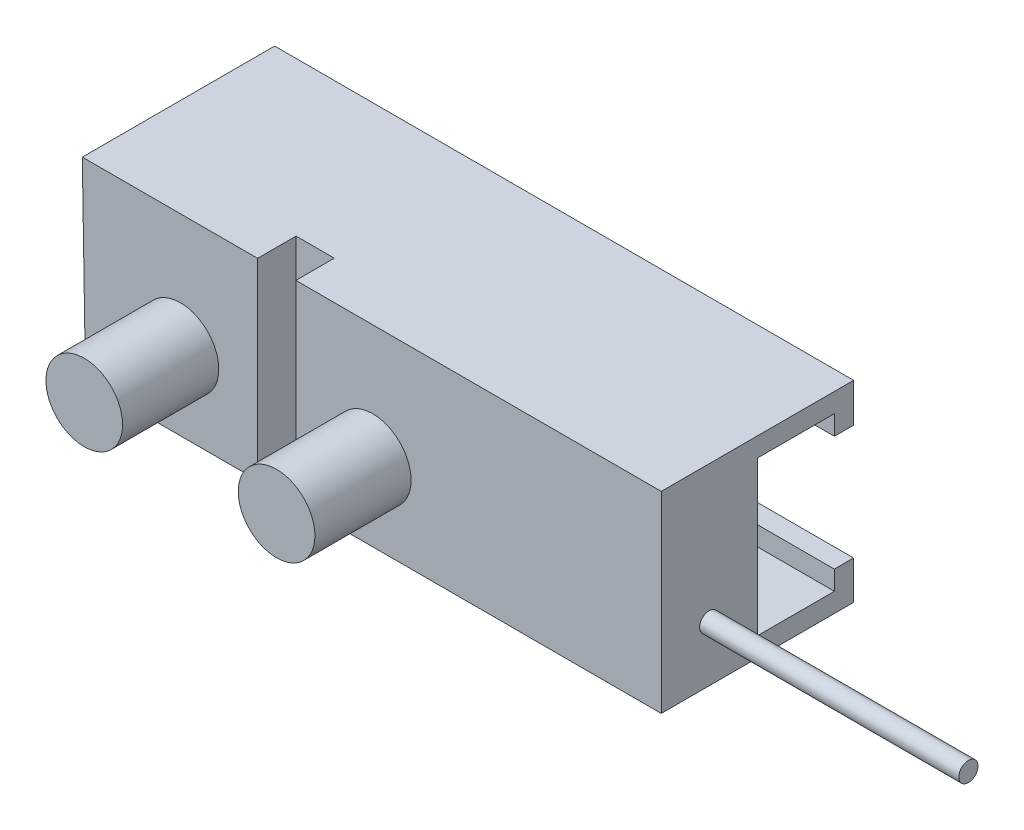
ISO-10303-21;
HEADER;
FILE_DESCRIPTION(('STEP AP214'),'2;1');
FILE_NAME('part.step','',(''),(''),'','','');
FILE_SCHEMA(('AUTOMOTIVE_DESIGN { 1 0 10303 214 1 1 1 1 }'));
ENDSEC;
DATA;
#1=APPLICATION_CONTEXT('core data for automotive mechanical design processes');
#2=APPLICATION_PROTOCOL_DEFINITION('international standard','automotive_design',2000,#1);
#3=PRODUCT_CONTEXT('',#1,'mechanical');
#4=PRODUCT('Part','Part','',(#3));
#5=PRODUCT_RELATED_PRODUCT_CATEGORY('part','',(#4));
#6=PRODUCT_DEFINITION_FORMATION('','',#4);
#7=PRODUCT_DEFINITION_CONTEXT('part definition',#1,'design');
#8=PRODUCT_DEFINITION('design','',#6,#7);
#9=PRODUCT_DEFINITION_SHAPE('','',#8);
#10=(LENGTH_UNIT() NAMED_UNIT(*) SI_UNIT(.MILLI.,.METRE.));
#11=(NAMED_UNIT(*) PLANE_ANGLE_UNIT() SI_UNIT($,.RADIAN.));
#12=(NAMED_UNIT(*) SI_UNIT($,.STERADIAN.) SOLID_ANGLE_UNIT());
#13=UNCERTAINTY_MEASURE_WITH_UNIT(LENGTH_MEASURE(1.E-05),#10,'distance_accuracy_value','');
#14=(GEOMETRIC_REPRESENTATION_CONTEXT(3) GLOBAL_UNCERTAINTY_ASSIGNED_CONTEXT((#13)) GLOBAL_UNIT_ASSIGNED_CONTEXT((#10,
#11,#12)) REPRESENTATION_CONTEXT('',''));
#15=CARTESIAN_POINT('',(0.,0.,0.));
#16=DIRECTION('',(0.,0.,1.));
#17=DIRECTION('',(1.,0.,0.));
#18=AXIS2_PLACEMENT_3D('',#15,#16,#17);
#19=CARTESIAN_POINT('',(39.9999991059303,2.88023595542859,2.51062049087374));
#20=DIRECTION('',(1.,0.,0.));
#21=DIRECTION('',(0.,0.,-1.));
#22=AXIS2_PLACEMENT_3D('',#19,#20,#21);
#23=PLANE('',#22);
#24=CARTESIAN_POINT('',(39.9999991059303,2.88023595542859,2.51062049087374));
#25=DIRECTION('',(1.,0.,0.));
#26=DIRECTION('',(0.,0.,-1.));
#27=AXIS2_PLACEMENT_3D('',#24,#25,#26);
#28=CIRCLE('',#27,0.5);
#29=CARTESIAN_POINT('',(39.9999991059303,2.88023595542859,2.01062049087374));
#30=VERTEX_POINT('',#29);
#31=EDGE_CURVE('E60',#30,#30,#28,.T.);
#32=ORIENTED_EDGE('',*,*,#31,.F.);
#33=EDGE_LOOP('',(#32));
#34=FACE_BOUND('',#33,.T.);
#35=ADVANCED_FACE('F53',(#34),#23,.F.);
#36=CARTESIAN_POINT('',(54.8932187387167,2.88023595542859,2.51062049087374));
#37=DIRECTION('',(-1.,0.,0.));
#38=DIRECTION('',(0.,0.,1.));
#39=AXIS2_PLACEMENT_3D('',#36,#37,#38);
#40=CYLINDRICAL_SURFACE('',#39,0.5);
#41=CARTESIAN_POINT('',(53.4790051763436,2.88023595542859,2.51062049087374));
#42=DIRECTION('',(-1.,0.,0.));
#43=DIRECTION('',(0.,0.,1.));
#44=AXIS2_PLACEMENT_3D('',#41,#42,#43);
#45=CIRCLE('',#44,0.5);
#46=CARTESIAN_POINT('',(53.4790051763436,2.88023595542859,3.01062049087374));
#47=VERTEX_POINT('',#46);
#48=EDGE_CURVE('E11',#47,#47,#45,.T.);
#49=ORIENTED_EDGE('',*,*,#48,.T.);
#50=EDGE_LOOP('',(#49));
#51=FACE_BOUND('',#50,.T.);
#52=ORIENTED_EDGE('',*,*,#31,.T.);
#53=EDGE_LOOP('',(#52));
#54=FACE_BOUND('',#53,.T.);
#55=ADVANCED_FACE('F55',(#51,#54),#40,.T.);
#56=CARTESIAN_POINT('',(53.4790051763436,-138.410911138441,-61.6779531971099));
#57=DIRECTION('',(-1.,0.,0.));
#58=DIRECTION('',(0.,0.,1.));
#59=AXIS2_PLACEMENT_3D('',#56,#57,#58);
#60=PLANE('',#59);
#61=ORIENTED_EDGE('',*,*,#48,.F.);
#62=EDGE_LOOP('',(#61));
#63=FACE_BOUND('',#62,.T.);
#64=ADVANCED_FACE('F71',(#63),#60,.F.);
#65=CLOSED_SHELL('',(#35,#55,#64));
#66=MANIFOLD_SOLID_BREP('B2',#65);
#67=CARTESIAN_POINT('',(-1.64213620169926,0.,4.99999988824129));
#68=DIRECTION('',(0.,0.,1.));
#69=DIRECTION('',(1.,0.,0.));
#70=AXIS2_PLACEMENT_3D('',#67,#68,#69);
#71=PLANE('',#70);
#72=DIRECTION('',(0.,1.,0.));
#73=VECTOR('',#72,1.);
#74=CARTESIAN_POINT('',(20.9999997168779,-2.81990806312765,4.99999988824129));
#75=LINE('',#74,#73);
#76=CARTESIAN_POINT('',(20.9999997168779,0.,4.99999988824129));
#77=VERTEX_POINT('',#76);
#78=CARTESIAN_POINT('',(20.9999997168779,9.99999977648258,4.99999988824129));
#79=VERTEX_POINT('',#78);
#80=EDGE_CURVE('E249',#77,#79,#75,.T.);
#81=ORIENTED_EDGE('',*,*,#80,.F.);
#82=DIRECTION('',(1.,0.,0.));
#83=VECTOR('',#82,1.);
#84=CARTESIAN_POINT('',(-1.64213620169926,0.,4.99999988824129));
#85=LINE('',#84,#83);
#86=CARTESIAN_POINT('',(39.9999991059303,0.,4.99999988824129));
#87=VERTEX_POINT('',#86);
#88=EDGE_CURVE('E308',#77,#87,#85,.T.);
#89=ORIENTED_EDGE('',*,*,#88,.T.);
#90=DIRECTION('',(0.,-1.,0.));
#91=VECTOR('',#90,1.);
#92=CARTESIAN_POINT('',(39.9999991059303,0.,4.99999988824129));
#93=LINE('',#92,#91);
#94=CARTESIAN_POINT('',(39.9999991059303,9.99999977648258,4.99999988824129));
#95=VERTEX_POINT('',#94);
#96=EDGE_CURVE('E303',#95,#87,#93,.T.);
#97=ORIENTED_EDGE('',*,*,#96,.F.);
#98=DIRECTION('',(1.,0.,0.));
#99=VECTOR('',#98,1.);
#100=CARTESIAN_POINT('',(-1.64213620169926,9.99999977648258,4.99999988824129));
#101=LINE('',#100,#99);
#102=EDGE_CURVE('E311',#79,#95,#101,.T.);
#103=ORIENTED_EDGE('',*,*,#102,.F.);
#104=EDGE_LOOP('',(#81,#89,#97,#103));
#105=FACE_BOUND('',#104,.T.);
#106=CARTESIAN_POINT('',(25.000000372529,3.99999984074384,4.99999988824129));
#107=DIRECTION('',(0.,0.,1.));
#108=DIRECTION('',(1.,0.,0.));
#109=AXIS2_PLACEMENT_3D('',#106,#107,#108);
#110=CIRCLE('',#109,1.99316896032542);
#111=CARTESIAN_POINT('',(26.9931693328544,3.99999984074384,4.99999988824129));
#112=VERTEX_POINT('',#111);
#113=EDGE_CURVE('E51',#112,#112,#110,.T.);
#114=ORIENTED_EDGE('',*,*,#113,.F.);
#115=EDGE_LOOP('',(#114));
#116=FACE_BOUND('',#115,.T.);
#117=ADVANCED_FACE('F99',(#105,#116),#71,.T.);
#118=CARTESIAN_POINT('',(39.9999991059303,0.,0.));
#119=DIRECTION('',(1.,0.,0.));
#120=DIRECTION('',(0.,0.,-1.));
#121=AXIS2_PLACEMENT_3D('',#118,#119,#120);
#122=PLANE('',#121);
#123=DIRECTION('',(0.,-1.,0.));
#124=VECTOR('',#123,1.);
#125=CARTESIAN_POINT('',(39.9999991059303,0.,-4.00000018998981));
#126=LINE('',#125,#124);
#127=CARTESIAN_POINT('',(39.9999991059303,8.99999961256981,-4.00000018998981));
#128=VERTEX_POINT('',#127);
#129=CARTESIAN_POINT('',(39.9999991059303,7.97875691205263,-4.00000018998981));
#130=VERTEX_POINT('',#129);
#131=EDGE_CURVE('E275',#128,#130,#126,.T.);
#132=ORIENTED_EDGE('',*,*,#131,.T.);
#133=DIRECTION('',(0.,0.,-1.));
#134=VECTOR('',#133,1.);
#135=CARTESIAN_POINT('',(39.9999991059303,7.97875691205263,0.));
#136=LINE('',#135,#134);
#137=CARTESIAN_POINT('',(39.9999991059303,7.97875691205263,-4.99999988824129));
#138=VERTEX_POINT('',#137);
#139=EDGE_CURVE('E306',#130,#138,#136,.T.);
#140=ORIENTED_EDGE('',*,*,#139,.T.);
#141=DIRECTION('',(0.,-1.,0.));
#142=VECTOR('',#141,1.);
#143=CARTESIAN_POINT('',(39.9999991059303,0.,-4.99999988824129));
#144=LINE('',#143,#142);
#145=CARTESIAN_POINT('',(39.9999991059303,9.99999977648258,-4.99999988824129));
#146=VERTEX_POINT('',#145);
#147=EDGE_CURVE('E225',#146,#138,#144,.T.);
#148=ORIENTED_EDGE('',*,*,#147,.F.);
#149=DIRECTION('',(0.,0.,-1.));
#150=VECTOR('',#149,1.);
#151=CARTESIAN_POINT('',(39.9999991059303,9.99999977648258,0.));
#152=LINE('',#151,#150);
#153=EDGE_CURVE('E220',#95,#146,#152,.T.);
#154=ORIENTED_EDGE('',*,*,#153,.F.);
#155=ORIENTED_EDGE('',*,*,#96,.T.);
#156=DIRECTION('',(0.,0.,-1.));
#157=VECTOR('',#156,1.);
#158=CARTESIAN_POINT('',(39.9999991059303,0.,0.));
#159=LINE('',#158,#157);
#160=CARTESIAN_POINT('',(39.9999991059303,0.,-4.99999988824129));
#161=VERTEX_POINT('',#160);
#162=EDGE_CURVE('E291',#87,#161,#159,.T.);
#163=ORIENTED_EDGE('',*,*,#162,.T.);
#164=DIRECTION('',(0.,-1.,0.));
#165=VECTOR('',#164,1.);
#166=CARTESIAN_POINT('',(39.9999991059303,0.,-4.99999988824129));
#167=LINE('',#166,#165);
#168=CARTESIAN_POINT('',(39.9999991059303,2.0000000949949,-4.99999988824129));
#169=VERTEX_POINT('',#168);
#170=EDGE_CURVE('E297',#169,#161,#167,.T.);
#171=ORIENTED_EDGE('',*,*,#170,.F.);
#172=DIRECTION('',(0.,0.,-1.));
#173=VECTOR('',#172,1.);
#174=CARTESIAN_POINT('',(39.9999991059303,2.0000000949949,0.));
#175=LINE('',#174,#173);
#176=CARTESIAN_POINT('',(39.9999991059303,2.0000000949949,-4.00000018998981));
#177=VERTEX_POINT('',#176);
#178=EDGE_CURVE('E292',#177,#169,#175,.T.);
#179=ORIENTED_EDGE('',*,*,#178,.F.);
#180=DIRECTION('',(0.,-1.,0.));
#181=VECTOR('',#180,1.);
#182=CARTESIAN_POINT('',(39.9999991059303,0.,-4.00000018998981));
#183=LINE('',#182,#181);
#184=CARTESIAN_POINT('',(39.9999991059303,1.00000004749745,-4.00000018998981));
#185=VERTEX_POINT('',#184);
#186=EDGE_CURVE('E279',#177,#185,#183,.T.);
#187=ORIENTED_EDGE('',*,*,#186,.T.);
#188=DIRECTION('',(0.,0.,-1.));
#189=VECTOR('',#188,1.);
#190=CARTESIAN_POINT('',(39.9999991059303,1.00000004749745,0.));
#191=LINE('',#190,#189);
#192=CARTESIAN_POINT('',(39.9999991059303,1.00000004749745,0.));
#193=VERTEX_POINT('',#192);
#194=EDGE_CURVE('E285',#193,#185,#191,.T.);
#195=ORIENTED_EDGE('',*,*,#194,.F.);
#196=DIRECTION('',(0.,-1.,0.));
#197=VECTOR('',#196,1.);
#198=CARTESIAN_POINT('',(39.9999991059303,0.,0.));
#199=LINE('',#198,#197);
#200=CARTESIAN_POINT('',(39.9999991059303,8.99999961256981,0.));
#201=VERTEX_POINT('',#200);
#202=EDGE_CURVE('E280',#201,#193,#199,.T.);
#203=ORIENTED_EDGE('',*,*,#202,.F.);
#204=DIRECTION('',(0.,0.,-1.));
#205=VECTOR('',#204,1.);
#206=CARTESIAN_POINT('',(39.9999991059303,8.99999961256981,0.));
#207=LINE('',#206,#205);
#208=EDGE_CURVE('E276',#201,#128,#207,.T.);
#209=ORIENTED_EDGE('',*,*,#208,.T.);
#210=EDGE_LOOP('',(#132,#140,#148,#154,#155,#163,#171,#179,#187,#195,#203,#209));
#211=FACE_BOUND('',#210,.T.);
#212=ADVANCED_FACE('F349',(#211),#122,.T.);
#213=CARTESIAN_POINT('',(-1.64213620169926,7.97875691205263,0.));
#214=DIRECTION('',(0.,-1.,0.));
#215=DIRECTION('',(0.,0.,-1.));
#216=AXIS2_PLACEMENT_3D('',#213,#214,#215);
#217=PLANE('',#216);
#218=DIRECTION('',(1.,0.,0.));
#219=VECTOR('',#218,1.);
#220=CARTESIAN_POINT('',(-1.64213620169926,7.97875691205263,-4.00000018998981));
#221=LINE('',#220,#219);
#222=CARTESIAN_POINT('',(9.93202454081561,7.97875691205263,-4.00000018998981));
#223=VERTEX_POINT('',#222);
#224=EDGE_CURVE('E122',#223,#130,#221,.T.);
#225=ORIENTED_EDGE('',*,*,#224,.F.);
#226=DIRECTION('',(0.,0.,-1.));
#227=VECTOR('',#226,1.);
#228=CARTESIAN_POINT('',(9.93202454081562,7.97875691205263,-4.99999988824129));
#229=LINE('',#228,#227);
#230=CARTESIAN_POINT('',(9.93202454081562,7.97875691205263,-4.99999988824129));
#231=VERTEX_POINT('',#230);
#232=EDGE_CURVE('E244',#223,#231,#229,.T.);
#233=ORIENTED_EDGE('',*,*,#232,.T.);
#234=DIRECTION('',(1.,0.,0.));
#235=VECTOR('',#234,1.);
#236=CARTESIAN_POINT('',(-1.64213620169926,7.97875691205263,-4.99999988824129));
#237=LINE('',#236,#235);
#238=EDGE_CURVE('E226',#231,#138,#237,.T.);
#239=ORIENTED_EDGE('',*,*,#238,.T.);
#240=ORIENTED_EDGE('',*,*,#139,.F.);
#241=EDGE_LOOP('',(#225,#233,#239,#240));
#242=FACE_BOUND('',#241,.T.);
#243=ADVANCED_FACE('F101',(#242),#217,.T.);
#244=CARTESIAN_POINT('',(-1.64213620169926,0.,-4.99999988824129));
#245=DIRECTION('',(0.,0.,1.));
#246=DIRECTION('',(1.,0.,0.));
#247=AXIS2_PLACEMENT_3D('',#244,#245,#246);
#248=PLANE('',#247);
#249=ORIENTED_EDGE('',*,*,#238,.F.);
#250=DIRECTION('',(-0.0165650611449048,0.999862789961335,0.));
#251=VECTOR('',#250,1.);
#252=CARTESIAN_POINT('',(9.89467977908192,10.2328770345721,-4.99999988824129));
#253=LINE('',#252,#251);
#254=CARTESIAN_POINT('',(9.89853793447908,9.99999977648258,-4.99999988824129));
#255=VERTEX_POINT('',#254);
#256=EDGE_CURVE('E234',#231,#255,#253,.T.);
#257=ORIENTED_EDGE('',*,*,#256,.T.);
#258=DIRECTION('',(1.,0.,0.));
#259=VECTOR('',#258,1.);
#260=CARTESIAN_POINT('',(-1.64213620169926,9.99999977648258,-4.99999988824129));
#261=LINE('',#260,#259);
#262=EDGE_CURVE('E213',#255,#146,#261,.T.);
#263=ORIENTED_EDGE('',*,*,#262,.T.);
#264=ORIENTED_EDGE('',*,*,#147,.T.);
#265=EDGE_LOOP('',(#249,#257,#263,#264));
#266=FACE_BOUND('',#265,.T.);
#267=ADVANCED_FACE('F240',(#266),#248,.F.);
#268=CARTESIAN_POINT('',(-1.64213620169926,9.99999977648258,0.));
#269=DIRECTION('',(0.,-1.,0.));
#270=DIRECTION('',(0.,0.,-1.));
#271=AXIS2_PLACEMENT_3D('',#268,#269,#270);
#272=PLANE('',#271);
#273=DIRECTION('',(-1.,0.,0.));
#274=VECTOR('',#273,1.);
#275=CARTESIAN_POINT('',(19.0120656043291,9.99999977648258,3.00000002607703));
#276=LINE('',#275,#274);
#277=CARTESIAN_POINT('',(20.9999997168779,9.99999977648258,3.00000002607703));
#278=VERTEX_POINT('',#277);
#279=CARTESIAN_POINT('',(19.0120656043291,9.99999977648258,3.00000002607703));
#280=VERTEX_POINT('',#279);
#281=EDGE_CURVE('E246',#278,#280,#276,.T.);
#282=ORIENTED_EDGE('',*,*,#281,.F.);
#283=DIRECTION('',(0.,0.,-1.));
#284=VECTOR('',#283,1.);
#285=CARTESIAN_POINT('',(20.9999997168779,9.99999977648258,4.99999988824129));
#286=LINE('',#285,#284);
#287=EDGE_CURVE('E250',#79,#278,#286,.T.);
#288=ORIENTED_EDGE('',*,*,#287,.F.);
#289=ORIENTED_EDGE('',*,*,#102,.T.);
#290=ORIENTED_EDGE('',*,*,#153,.T.);
#291=ORIENTED_EDGE('',*,*,#262,.F.);
#292=DIRECTION('',(0.,0.,1.));
#293=VECTOR('',#292,1.);
#294=CARTESIAN_POINT('',(9.89853793447908,9.99999977648258,4.99999988824129));
#295=LINE('',#294,#293);
#296=CARTESIAN_POINT('',(9.89853793447908,9.99999977648258,4.99999988824129));
#297=VERTEX_POINT('',#296);
#298=EDGE_CURVE('E218',#255,#297,#295,.T.);
#299=ORIENTED_EDGE('',*,*,#298,.T.);
#300=CARTESIAN_POINT('',(19.0120656043291,9.99999977648258,4.99999988824129));
#301=VERTEX_POINT('',#300);
#302=EDGE_CURVE('E309',#297,#301,#101,.T.);
#303=ORIENTED_EDGE('',*,*,#302,.T.);
#304=DIRECTION('',(0.,0.,1.));
#305=VECTOR('',#304,1.);
#306=CARTESIAN_POINT('',(19.0120656043291,9.99999977648258,4.99999988824129));
#307=LINE('',#306,#305);
#308=EDGE_CURVE('E253',#280,#301,#307,.T.);
#309=ORIENTED_EDGE('',*,*,#308,.F.);
#310=EDGE_LOOP('',(#282,#288,#289,#290,#291,#299,#303,#309));
#311=FACE_BOUND('',#310,.T.);
#312=ADVANCED_FACE('F216',(#311),#272,.F.);
#313=DIRECTION('',(0.,1.,0.));
#314=VECTOR('',#313,1.);
#315=CARTESIAN_POINT('',(19.0120656043291,-2.81990806312765,4.99999988824129));
#316=LINE('',#315,#314);
#317=CARTESIAN_POINT('',(19.0120656043291,0.,4.99999988824129));
#318=VERTEX_POINT('',#317);
#319=EDGE_CURVE('E114',#318,#301,#316,.T.);
#320=ORIENTED_EDGE('',*,*,#319,.T.);
#321=ORIENTED_EDGE('',*,*,#302,.F.);
#322=DIRECTION('',(0.0165650611449048,-0.999862789961335,0.));
#323=VECTOR('',#322,1.);
#324=CARTESIAN_POINT('',(10.0603076579021,0.235621270535495,4.99999988824129));
#325=LINE('',#324,#323);
#326=CARTESIAN_POINT('',(10.0642112742709,0.,4.99999988824129));
#327=VERTEX_POINT('',#326);
#328=EDGE_CURVE('E238',#297,#327,#325,.T.);
#329=ORIENTED_EDGE('',*,*,#328,.T.);
#330=EDGE_CURVE('E324',#327,#318,#85,.T.);
#331=ORIENTED_EDGE('',*,*,#330,.T.);
#332=EDGE_LOOP('',(#320,#321,#329,#331));
#333=FACE_BOUND('',#332,.T.);
#334=CARTESIAN_POINT('',(14.9999996647239,3.99999984074384,4.99999988824129));
#335=DIRECTION('',(0.,0.,1.));
#336=DIRECTION('',(1.,0.,0.));
#337=AXIS2_PLACEMENT_3D('',#334,#335,#336);
#338=CIRCLE('',#337,1.99316896032542);
#339=CARTESIAN_POINT('',(16.9931686250493,3.99999984074384,4.99999988824129));
#340=VERTEX_POINT('',#339);
#341=EDGE_CURVE('E107',#340,#340,#338,.T.);
#342=ORIENTED_EDGE('',*,*,#341,.F.);
#343=EDGE_LOOP('',(#342));
#344=FACE_BOUND('',#343,.T.);
#345=ADVANCED_FACE('F335',(#333,#344),#71,.T.);
#346=CARTESIAN_POINT('',(-1.64213620169926,0.,0.));
#347=DIRECTION('',(0.,-1.,0.));
#348=DIRECTION('',(0.,0.,-1.));
#349=AXIS2_PLACEMENT_3D('',#346,#347,#348);
#350=PLANE('',#349);
#351=DIRECTION('',(0.,0.,-1.));
#352=VECTOR('',#351,1.);
#353=CARTESIAN_POINT('',(20.9999997168779,0.,4.99999988824129));
#354=LINE('',#353,#352);
#355=CARTESIAN_POINT('',(20.9999997168779,0.,3.00000002607703));
#356=VERTEX_POINT('',#355);
#357=EDGE_CURVE('E262',#77,#356,#354,.T.);
#358=ORIENTED_EDGE('',*,*,#357,.T.);
#359=DIRECTION('',(-1.,0.,0.));
#360=VECTOR('',#359,1.);
#361=CARTESIAN_POINT('',(19.0120656043291,0.,3.00000002607703));
#362=LINE('',#361,#360);
#363=CARTESIAN_POINT('',(19.0120656043291,0.,3.00000002607703));
#364=VERTEX_POINT('',#363);
#365=EDGE_CURVE('E258',#356,#364,#362,.T.);
#366=ORIENTED_EDGE('',*,*,#365,.T.);
#367=DIRECTION('',(0.,0.,1.));
#368=VECTOR('',#367,1.);
#369=CARTESIAN_POINT('',(19.0120656043291,0.,4.99999988824129));
#370=LINE('',#369,#368);
#371=EDGE_CURVE('E255',#364,#318,#370,.T.);
#372=ORIENTED_EDGE('',*,*,#371,.T.);
#373=ORIENTED_EDGE('',*,*,#330,.F.);
#374=DIRECTION('',(0.,0.,-1.));
#375=VECTOR('',#374,1.);
#376=CARTESIAN_POINT('',(10.0642112742709,0.,-4.99999988824129));
#377=LINE('',#376,#375);
#378=CARTESIAN_POINT('',(10.0642112742709,0.,-4.99999988824129));
#379=VERTEX_POINT('',#378);
#380=EDGE_CURVE('E420',#327,#379,#377,.T.);
#381=ORIENTED_EDGE('',*,*,#380,.T.);
#382=DIRECTION('',(1.,0.,0.));
#383=VECTOR('',#382,1.);
#384=CARTESIAN_POINT('',(-1.64213620169926,0.,-4.99999988824129));
#385=LINE('',#384,#383);
#386=EDGE_CURVE('E322',#379,#161,#385,.T.);
#387=ORIENTED_EDGE('',*,*,#386,.T.);
#388=ORIENTED_EDGE('',*,*,#162,.F.);
#389=ORIENTED_EDGE('',*,*,#88,.F.);
#390=EDGE_LOOP('',(#358,#366,#372,#373,#381,#387,#388,#389));
#391=FACE_BOUND('',#390,.T.);
#392=ADVANCED_FACE('F337',(#391),#350,.T.);
#393=CARTESIAN_POINT('',(-1.64213620169926,0.,-4.99999988824129));
#394=DIRECTION('',(0.,0.,1.));
#395=DIRECTION('',(1.,0.,0.));
#396=AXIS2_PLACEMENT_3D('',#393,#394,#395);
#397=PLANE('',#396);
#398=ORIENTED_EDGE('',*,*,#386,.F.);
#399=DIRECTION('',(-0.0165650611449048,0.999862789961335,0.));
#400=VECTOR('',#399,1.);
#401=CARTESIAN_POINT('',(10.0271820798243,2.23507256300286,-4.99999988824129));
#402=LINE('',#401,#400);
#403=CARTESIAN_POINT('',(10.0310766039981,2.0000000949949,-4.99999988824129));
#404=VERTEX_POINT('',#403);
#405=EDGE_CURVE('E415',#379,#404,#402,.T.);
#406=ORIENTED_EDGE('',*,*,#405,.T.);
#407=DIRECTION('',(1.,0.,0.));
#408=VECTOR('',#407,1.);
#409=CARTESIAN_POINT('',(-1.64213620169926,2.0000000949949,-4.99999988824129));
#410=LINE('',#409,#408);
#411=EDGE_CURVE('E300',#404,#169,#410,.T.);
#412=ORIENTED_EDGE('',*,*,#411,.T.);
#413=ORIENTED_EDGE('',*,*,#170,.T.);
#414=EDGE_LOOP('',(#398,#406,#412,#413));
#415=FACE_BOUND('',#414,.T.);
#416=ADVANCED_FACE('F344',(#415),#397,.F.);
#417=CARTESIAN_POINT('',(-1.64213620169926,2.0000000949949,0.));
#418=DIRECTION('',(0.,-1.,0.));
#419=DIRECTION('',(0.,0.,-1.));
#420=AXIS2_PLACEMENT_3D('',#417,#418,#419);
#421=PLANE('',#420);
#422=ORIENTED_EDGE('',*,*,#411,.F.);
#423=DIRECTION('',(0.,0.,1.));
#424=VECTOR('',#423,1.);
#425=CARTESIAN_POINT('',(10.0310766039981,2.0000000949949,-4.00000018998981));
#426=LINE('',#425,#424);
#427=CARTESIAN_POINT('',(10.0310766039981,2.0000000949949,-4.00000018998981));
#428=VERTEX_POINT('',#427);
#429=EDGE_CURVE('E423',#404,#428,#426,.T.);
#430=ORIENTED_EDGE('',*,*,#429,.T.);
#431=DIRECTION('',(1.,0.,0.));
#432=VECTOR('',#431,1.);
#433=CARTESIAN_POINT('',(-1.64213620169926,2.0000000949949,-4.00000018998981));
#434=LINE('',#433,#432);
#435=EDGE_CURVE('E296',#428,#177,#434,.T.);
#436=ORIENTED_EDGE('',*,*,#435,.T.);
#437=ORIENTED_EDGE('',*,*,#178,.T.);
#438=EDGE_LOOP('',(#422,#430,#436,#437));
#439=FACE_BOUND('',#438,.T.);
#440=ADVANCED_FACE('F404',(#439),#421,.F.);
#441=CARTESIAN_POINT('',(-1.64213620169926,0.,-4.00000018998981));
#442=DIRECTION('',(0.,0.,1.));
#443=DIRECTION('',(1.,0.,0.));
#444=AXIS2_PLACEMENT_3D('',#441,#442,#443);
#445=PLANE('',#444);
#446=ORIENTED_EDGE('',*,*,#435,.F.);
#447=DIRECTION('',(0.0165650611449048,-0.999862789961335,0.));
#448=VECTOR('',#447,1.);
#449=CARTESIAN_POINT('',(10.0437448688632,1.23534691676918,-4.00000018998981));
#450=LINE('',#449,#448);
#451=CARTESIAN_POINT('',(10.0476439391345,1.00000004749745,-4.00000018998981));
#452=VERTEX_POINT('',#451);
#453=EDGE_CURVE('E429',#428,#452,#450,.T.);
#454=ORIENTED_EDGE('',*,*,#453,.T.);
#455=DIRECTION('',(1.,0.,0.));
#456=VECTOR('',#455,1.);
#457=CARTESIAN_POINT('',(-1.64213620169926,1.00000004749745,-4.00000018998981));
#458=LINE('',#457,#456);
#459=EDGE_CURVE('E295',#452,#185,#458,.T.);
#460=ORIENTED_EDGE('',*,*,#459,.T.);
#461=ORIENTED_EDGE('',*,*,#186,.F.);
#462=EDGE_LOOP('',(#446,#454,#460,#461));
#463=FACE_BOUND('',#462,.T.);
#464=ADVANCED_FACE('F400',(#463),#445,.T.);
#465=CARTESIAN_POINT('',(-1.64213620169926,1.00000004749745,0.));
#466=DIRECTION('',(0.,-1.,0.));
#467=DIRECTION('',(0.,0.,-1.));
#468=AXIS2_PLACEMENT_3D('',#465,#466,#467);
#469=PLANE('',#468);
#470=ORIENTED_EDGE('',*,*,#459,.F.);
#471=DIRECTION('',(0.,0.,1.));
#472=VECTOR('',#471,1.);
#473=CARTESIAN_POINT('',(10.0476439391345,1.00000004749745,0.));
#474=LINE('',#473,#472);
#475=CARTESIAN_POINT('',(10.0476439391345,1.00000004749745,0.));
#476=VERTEX_POINT('',#475);
#477=EDGE_CURVE('E432',#452,#476,#474,.T.);
#478=ORIENTED_EDGE('',*,*,#477,.T.);
#479=DIRECTION('',(1.,0.,0.));
#480=VECTOR('',#479,1.);
#481=CARTESIAN_POINT('',(-1.64213620169926,1.00000004749745,0.));
#482=LINE('',#481,#480);
#483=EDGE_CURVE('E288',#476,#193,#482,.T.);
#484=ORIENTED_EDGE('',*,*,#483,.T.);
#485=ORIENTED_EDGE('',*,*,#194,.T.);
#486=EDGE_LOOP('',(#470,#478,#484,#485));
#487=FACE_BOUND('',#486,.T.);
#488=ADVANCED_FACE('F396',(#487),#469,.F.);
#489=CARTESIAN_POINT('',(-1.64213620169926,0.,0.));
#490=DIRECTION('',(0.,0.,1.));
#491=DIRECTION('',(1.,0.,0.));
#492=AXIS2_PLACEMENT_3D('',#489,#490,#491);
#493=PLANE('',#492);
#494=ORIENTED_EDGE('',*,*,#483,.F.);
#495=DIRECTION('',(-0.0165650611449048,0.999862789961335,0.));
#496=VECTOR('',#495,1.);
#497=CARTESIAN_POINT('',(9.91124257004899,9.23315127195501,0.));
#498=LINE('',#497,#496);
#499=CARTESIAN_POINT('',(9.91510527154417,8.99999961256981,0.));
#500=VERTEX_POINT('',#499);
#501=EDGE_CURVE('E435',#476,#500,#498,.T.);
#502=ORIENTED_EDGE('',*,*,#501,.T.);
#503=DIRECTION('',(1.,0.,0.));
#504=VECTOR('',#503,1.);
#505=CARTESIAN_POINT('',(-1.64213620169926,8.99999961256981,0.));
#506=LINE('',#505,#504);
#507=EDGE_CURVE('E284',#500,#201,#506,.T.);
#508=ORIENTED_EDGE('',*,*,#507,.T.);
#509=ORIENTED_EDGE('',*,*,#202,.T.);
#510=EDGE_LOOP('',(#494,#502,#508,#509));
#511=FACE_BOUND('',#510,.T.);
#512=ADVANCED_FACE('F392',(#511),#493,.F.);
#513=CARTESIAN_POINT('',(-1.64213620169926,8.99999961256981,0.));
#514=DIRECTION('',(0.,-1.,0.));
#515=DIRECTION('',(0.,0.,-1.));
#516=AXIS2_PLACEMENT_3D('',#513,#514,#515);
#517=PLANE('',#516);
#518=ORIENTED_EDGE('',*,*,#507,.F.);
#519=DIRECTION('',(0.,0.,-1.));
#520=VECTOR('',#519,1.);
#521=CARTESIAN_POINT('',(9.91510527154417,8.99999961256981,-4.00000018998981));
#522=LINE('',#521,#520);
#523=CARTESIAN_POINT('',(9.91510527154417,8.99999961256981,-4.00000018998981));
#524=VERTEX_POINT('',#523);
#525=EDGE_CURVE('E438',#500,#524,#522,.T.);
#526=ORIENTED_EDGE('',*,*,#525,.T.);
#527=DIRECTION('',(1.,0.,0.));
#528=VECTOR('',#527,1.);
#529=CARTESIAN_POINT('',(-1.64213620169926,8.99999961256981,-4.00000018998981));
#530=LINE('',#529,#528);
#531=EDGE_CURVE('E283',#524,#128,#530,.T.);
#532=ORIENTED_EDGE('',*,*,#531,.T.);
#533=ORIENTED_EDGE('',*,*,#208,.F.);
#534=EDGE_LOOP('',(#518,#526,#532,#533));
#535=FACE_BOUND('',#534,.T.);
#536=ADVANCED_FACE('F389',(#535),#517,.T.);
#537=CARTESIAN_POINT('',(-1.64213620169926,0.,-4.00000018998981));
#538=DIRECTION('',(0.,0.,1.));
#539=DIRECTION('',(1.,0.,0.));
#540=AXIS2_PLACEMENT_3D('',#537,#538,#539);
#541=PLANE('',#540);
#542=ORIENTED_EDGE('',*,*,#531,.F.);
#543=DIRECTION('',(0.0165650611449048,-0.999862789961335,0.));
#544=VECTOR('',#543,1.);
#545=CARTESIAN_POINT('',(9.92815719665179,8.21218880171215,-4.00000018998981));
#546=LINE('',#545,#544);
#547=EDGE_CURVE('E440',#524,#223,#546,.T.);
#548=ORIENTED_EDGE('',*,*,#547,.T.);
#549=ORIENTED_EDGE('',*,*,#224,.T.);
#550=ORIENTED_EDGE('',*,*,#131,.F.);
#551=EDGE_LOOP('',(#542,#548,#549,#550));
#552=FACE_BOUND('',#551,.T.);
#553=ADVANCED_FACE('F385',(#552),#541,.T.);
#554=CARTESIAN_POINT('',(14.9999996647239,3.99999984074384,-0.637533263345289));
#555=DIRECTION('',(0.,0.,1.));
#556=DIRECTION('',(1.,0.,0.));
#557=AXIS2_PLACEMENT_3D('',#554,#555,#556);
#558=CYLINDRICAL_SURFACE('',#557,1.99316896032542);
#559=ORIENTED_EDGE('',*,*,#341,.T.);
#560=EDGE_LOOP('',(#559));
#561=FACE_BOUND('',#560,.T.);
#562=CARTESIAN_POINT('',(14.9999996647239,3.99999984074384,9.99999977648258));
#563=DIRECTION('',(0.,0.,1.));
#564=DIRECTION('',(1.,0.,0.));
#565=AXIS2_PLACEMENT_3D('',#562,#563,#564);
#566=CIRCLE('',#565,1.99316896032542);
#567=CARTESIAN_POINT('',(16.9931686250493,3.99999984074384,9.99999977648258));
#568=VERTEX_POINT('',#567);
#569=EDGE_CURVE('E272',#568,#568,#566,.T.);
#570=ORIENTED_EDGE('',*,*,#569,.F.);
#571=EDGE_LOOP('',(#570));
#572=FACE_BOUND('',#571,.T.);
#573=ADVANCED_FACE('F332',(#561,#572),#558,.T.);
#574=CARTESIAN_POINT('',(0.,0.,9.99999977648258));
#575=DIRECTION('',(0.,0.,1.));
#576=DIRECTION('',(1.,0.,0.));
#577=AXIS2_PLACEMENT_3D('',#574,#575,#576);
#578=PLANE('',#577);
#579=ORIENTED_EDGE('',*,*,#569,.T.);
#580=EDGE_LOOP('',(#579));
#581=FACE_BOUND('',#580,.T.);
#582=ADVANCED_FACE('F366',(#581),#578,.T.);
#583=CARTESIAN_POINT('',(25.000000372529,3.99999984074384,-0.637533263345289));
#584=DIRECTION('',(0.,0.,1.));
#585=DIRECTION('',(1.,0.,0.));
#586=AXIS2_PLACEMENT_3D('',#583,#584,#585);
#587=CYLINDRICAL_SURFACE('',#586,1.99316896032542);
#588=ORIENTED_EDGE('',*,*,#113,.T.);
#589=EDGE_LOOP('',(#588));
#590=FACE_BOUND('',#589,.T.);
#591=CARTESIAN_POINT('',(25.000000372529,3.99999984074384,9.99999977648258));
#592=DIRECTION('',(0.,0.,1.));
#593=DIRECTION('',(1.,0.,0.));
#594=AXIS2_PLACEMENT_3D('',#591,#592,#593);
#595=CIRCLE('',#594,1.99316896032542);
#596=CARTESIAN_POINT('',(26.9931693328544,3.99999984074384,9.99999977648258));
#597=VERTEX_POINT('',#596);
#598=EDGE_CURVE('E269',#597,#597,#595,.T.);
#599=ORIENTED_EDGE('',*,*,#598,.F.);
#600=EDGE_LOOP('',(#599));
#601=FACE_BOUND('',#600,.T.);
#602=ADVANCED_FACE('F362',(#590,#601),#587,.T.);
#603=CARTESIAN_POINT('',(0.,0.,9.99999977648258));
#604=DIRECTION('',(0.,0.,1.));
#605=DIRECTION('',(1.,0.,0.));
#606=AXIS2_PLACEMENT_3D('',#603,#604,#605);
#607=PLANE('',#606);
#608=ORIENTED_EDGE('',*,*,#598,.T.);
#609=EDGE_LOOP('',(#608));
#610=FACE_BOUND('',#609,.T.);
#611=ADVANCED_FACE('F365',(#610),#607,.T.);
#612=CARTESIAN_POINT('',(20.9999997168779,-2.81990806312765,4.99999988824129));
#613=DIRECTION('',(1.,0.,0.));
#614=DIRECTION('',(0.,0.,-1.));
#615=AXIS2_PLACEMENT_3D('',#612,#613,#614);
#616=PLANE('',#615);
#617=ORIENTED_EDGE('',*,*,#80,.T.);
#618=ORIENTED_EDGE('',*,*,#287,.T.);
#619=DIRECTION('',(0.,1.,0.));
#620=VECTOR('',#619,1.);
#621=CARTESIAN_POINT('',(20.9999997168779,-2.81990806312765,3.00000002607703));
#622=LINE('',#621,#620);
#623=EDGE_CURVE('E261',#356,#278,#622,.T.);
#624=ORIENTED_EDGE('',*,*,#623,.F.);
#625=ORIENTED_EDGE('',*,*,#357,.F.);
#626=EDGE_LOOP('',(#617,#618,#624,#625));
#627=FACE_BOUND('',#626,.T.);
#628=ADVANCED_FACE('F371',(#627),#616,.F.);
#629=CARTESIAN_POINT('',(19.0120656043291,-2.81990806312765,3.00000002607703));
#630=DIRECTION('',(0.,0.,-1.));
#631=DIRECTION('',(-1.,0.,0.));
#632=AXIS2_PLACEMENT_3D('',#629,#630,#631);
#633=PLANE('',#632);
#634=ORIENTED_EDGE('',*,*,#623,.T.);
#635=ORIENTED_EDGE('',*,*,#281,.T.);
#636=DIRECTION('',(0.,1.,0.));
#637=VECTOR('',#636,1.);
#638=CARTESIAN_POINT('',(19.0120656043291,-2.81990806312765,3.00000002607703));
#639=LINE('',#638,#637);
#640=EDGE_CURVE('E257',#364,#280,#639,.T.);
#641=ORIENTED_EDGE('',*,*,#640,.F.);
#642=ORIENTED_EDGE('',*,*,#365,.F.);
#643=EDGE_LOOP('',(#634,#635,#641,#642));
#644=FACE_BOUND('',#643,.T.);
#645=ADVANCED_FACE('F376',(#644),#633,.F.);
#646=CARTESIAN_POINT('',(19.0120656043291,-2.81990806312765,4.99999988824129));
#647=DIRECTION('',(-1.,0.,0.));
#648=DIRECTION('',(0.,0.,1.));
#649=AXIS2_PLACEMENT_3D('',#646,#647,#648);
#650=PLANE('',#649);
#651=ORIENTED_EDGE('',*,*,#640,.T.);
#652=ORIENTED_EDGE('',*,*,#308,.T.);
#653=ORIENTED_EDGE('',*,*,#319,.F.);
#654=ORIENTED_EDGE('',*,*,#371,.F.);
#655=EDGE_LOOP('',(#651,#652,#653,#654));
#656=FACE_BOUND('',#655,.T.);
#657=ADVANCED_FACE('F456',(#656),#650,.F.);
#658=CARTESIAN_POINT('',(9.92751574795693,8.25090647839628,8.39999988824129));
#659=DIRECTION('',(0.999862789961335,0.0165650611449048,0.));
#660=DIRECTION('',(-0.0165650611449048,0.999862789961335,0.));
#661=AXIS2_PLACEMENT_3D('',#658,#659,#660);
#662=PLANE('',#661);
#663=ORIENTED_EDGE('',*,*,#547,.F.);
#664=ORIENTED_EDGE('',*,*,#525,.F.);
#665=ORIENTED_EDGE('',*,*,#501,.F.);
#666=ORIENTED_EDGE('',*,*,#477,.F.);
#667=ORIENTED_EDGE('',*,*,#453,.F.);
#668=ORIENTED_EDGE('',*,*,#429,.F.);
#669=ORIENTED_EDGE('',*,*,#405,.F.);
#670=ORIENTED_EDGE('',*,*,#380,.F.);
#671=ORIENTED_EDGE('',*,*,#328,.F.);
#672=ORIENTED_EDGE('',*,*,#298,.F.);
#673=ORIENTED_EDGE('',*,*,#256,.F.);
#674=ORIENTED_EDGE('',*,*,#232,.F.);
#675=EDGE_LOOP('',(#663,#664,#665,#666,#667,#668,#669,#670,#671,#672,#673,#674));
#676=FACE_BOUND('',#675,.T.);
#677=ADVANCED_FACE('F232',(#676),#662,.F.);
#678=CLOSED_SHELL('',(#117,#212,#243,#267,#312,#345,#392,#416,#440,#464,#488,#512,#536,#553,
#573,#582,#602,#611,#628,#645,#657,#677));
#679=MANIFOLD_SOLID_BREP('B6',#678);
#680=ADVANCED_BREP_SHAPE_REPRESENTATION('',(#18,#66,#679),#14);
#681=SHAPE_DEFINITION_REPRESENTATION(#9,#680);
ENDSEC;
END-ISO-10303-21;
